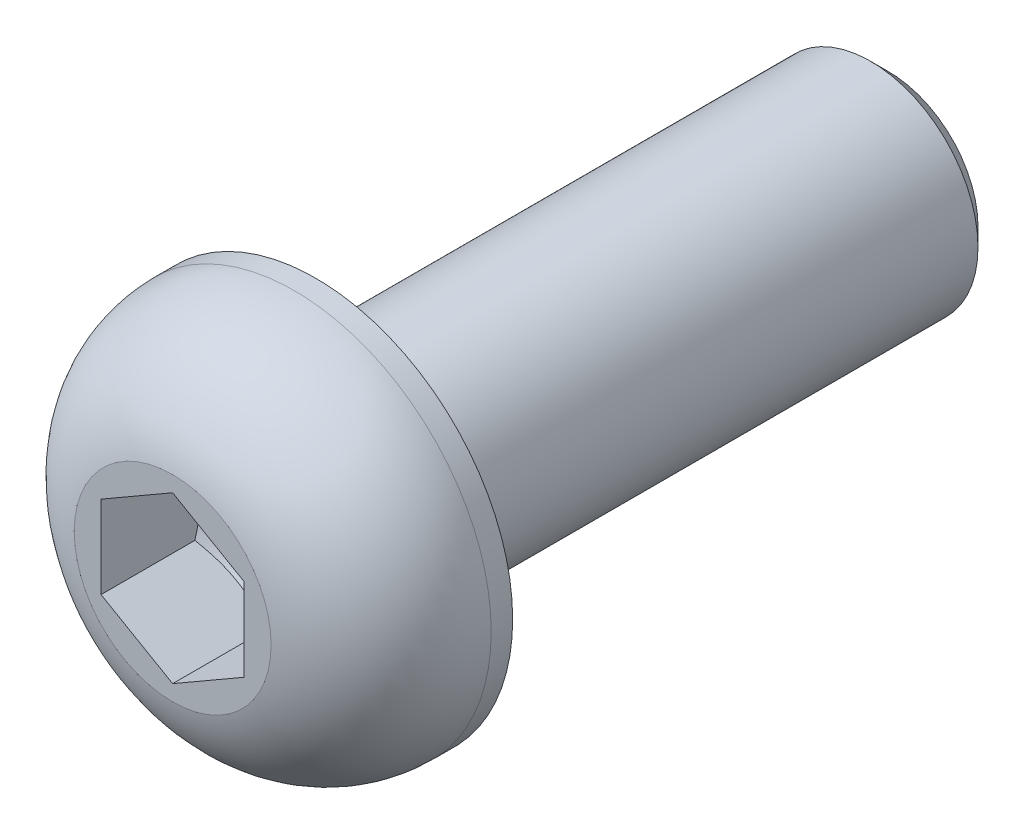
ISO-10303-21;
HEADER;
FILE_DESCRIPTION(('STEP AP214'),'2;1');
FILE_NAME('part.step','',(''),(''),'','','');
FILE_SCHEMA(('AUTOMOTIVE_DESIGN { 1 0 10303 214 1 1 1 1 }'));
ENDSEC;
DATA;
#1=APPLICATION_CONTEXT('core data for automotive mechanical design processes');
#2=APPLICATION_PROTOCOL_DEFINITION('international standard','automotive_design',2000,#1);
#3=PRODUCT_CONTEXT('',#1,'mechanical');
#4=PRODUCT('Part','Part','',(#3));
#5=PRODUCT_RELATED_PRODUCT_CATEGORY('part','',(#4));
#6=PRODUCT_DEFINITION_FORMATION('','',#4);
#7=PRODUCT_DEFINITION_CONTEXT('part definition',#1,'design');
#8=PRODUCT_DEFINITION('design','',#6,#7);
#9=PRODUCT_DEFINITION_SHAPE('','',#8);
#10=(LENGTH_UNIT() NAMED_UNIT(*) SI_UNIT(.MILLI.,.METRE.));
#11=(NAMED_UNIT(*) PLANE_ANGLE_UNIT() SI_UNIT($,.RADIAN.));
#12=(NAMED_UNIT(*) SI_UNIT($,.STERADIAN.) SOLID_ANGLE_UNIT());
#13=UNCERTAINTY_MEASURE_WITH_UNIT(LENGTH_MEASURE(1.E-05),#10,'distance_accuracy_value','');
#14=(GEOMETRIC_REPRESENTATION_CONTEXT(3) GLOBAL_UNCERTAINTY_ASSIGNED_CONTEXT((#13)) GLOBAL_UNIT_ASSIGNED_CONTEXT((#10,
#11,#12)) REPRESENTATION_CONTEXT('',''));
#15=CARTESIAN_POINT('',(0.,0.,0.));
#16=DIRECTION('',(0.,0.,1.));
#17=DIRECTION('',(1.,0.,0.));
#18=AXIS2_PLACEMENT_3D('',#15,#16,#17);
#19=CARTESIAN_POINT('',(0.,1.375,2.));
#20=DIRECTION('',(0.,0.,-1.));
#21=DIRECTION('',(-1.,0.,0.));
#22=AXIS2_PLACEMENT_3D('',#19,#20,#21);
#23=PLANE('',#22);
#24=CARTESIAN_POINT('',(0.,0.,2.));
#25=DIRECTION('',(0.,0.,1.));
#26=DIRECTION('',(1.,0.,0.));
#27=AXIS2_PLACEMENT_3D('',#24,#25,#26);
#28=CIRCLE('',#27,1.375);
#29=CARTESIAN_POINT('',(1.375,0.,2.));
#30=VERTEX_POINT('',#29);
#31=EDGE_CURVE('E160',#30,#30,#28,.T.);
#32=ORIENTED_EDGE('',*,*,#31,.T.);
#33=EDGE_LOOP('',(#32));
#34=FACE_BOUND('',#33,.T.);
#35=DIRECTION('',(-0.866025403784438,-0.5,0.));
#36=VECTOR('',#35,1.);
#37=CARTESIAN_POINT('',(0.,1.15470053837925,2.));
#38=LINE('',#37,#36);
#39=CARTESIAN_POINT('',(0.,1.15470053837925,2.));
#40=VERTEX_POINT('',#39);
#41=CARTESIAN_POINT('',(-1.,0.577350269189624,2.));
#42=VERTEX_POINT('',#41);
#43=EDGE_CURVE('E98',#40,#42,#38,.T.);
#44=ORIENTED_EDGE('',*,*,#43,.F.);
#45=DIRECTION('',(-0.866025403784439,0.5,0.));
#46=VECTOR('',#45,1.);
#47=CARTESIAN_POINT('',(1.,0.577350269189625,2.));
#48=LINE('',#47,#46);
#49=CARTESIAN_POINT('',(1.,0.577350269189625,2.));
#50=VERTEX_POINT('',#49);
#51=EDGE_CURVE('E58',#50,#40,#48,.T.);
#52=ORIENTED_EDGE('',*,*,#51,.F.);
#53=DIRECTION('',(0.,1.,0.));
#54=VECTOR('',#53,1.);
#55=CARTESIAN_POINT('',(1.,-0.577350269189626,2.));
#56=LINE('',#55,#54);
#57=CARTESIAN_POINT('',(1.,-0.577350269189626,2.));
#58=VERTEX_POINT('',#57);
#59=EDGE_CURVE('E133',#58,#50,#56,.T.);
#60=ORIENTED_EDGE('',*,*,#59,.F.);
#61=DIRECTION('',(0.866025403784439,0.5,0.));
#62=VECTOR('',#61,1.);
#63=CARTESIAN_POINT('',(0.,-1.15470053837925,2.));
#64=LINE('',#63,#62);
#65=CARTESIAN_POINT('',(0.,-1.15470053837925,2.));
#66=VERTEX_POINT('',#65);
#67=EDGE_CURVE('E126',#66,#58,#64,.T.);
#68=ORIENTED_EDGE('',*,*,#67,.F.);
#69=DIRECTION('',(0.866025403784439,-0.5,0.));
#70=VECTOR('',#69,1.);
#71=CARTESIAN_POINT('',(-1.,-0.577350269189625,2.));
#72=LINE('',#71,#70);
#73=CARTESIAN_POINT('',(-1.,-0.577350269189625,2.));
#74=VERTEX_POINT('',#73);
#75=EDGE_CURVE('E120',#74,#66,#72,.T.);
#76=ORIENTED_EDGE('',*,*,#75,.F.);
#77=DIRECTION('',(0.,-1.,0.));
#78=VECTOR('',#77,1.);
#79=CARTESIAN_POINT('',(-1.,0.577350269189624,2.));
#80=LINE('',#79,#78);
#81=EDGE_CURVE('E107',#42,#74,#80,.T.);
#82=ORIENTED_EDGE('',*,*,#81,.F.);
#83=EDGE_LOOP('',(#44,#52,#60,#68,#76,#82));
#84=FACE_BOUND('',#83,.T.);
#85=ADVANCED_FACE('F42',(#34,#84),#23,.F.);
#86=CARTESIAN_POINT('',(0.,0.,-8.));
#87=DIRECTION('',(0.,0.,1.));
#88=DIRECTION('',(1.,0.,0.));
#89=AXIS2_PLACEMENT_3D('',#86,#87,#88);
#90=PLANE('',#89);
#91=CARTESIAN_POINT('',(0.,0.,-8.));
#92=DIRECTION('',(0.,0.,1.));
#93=DIRECTION('',(1.,0.,0.));
#94=AXIS2_PLACEMENT_3D('',#91,#92,#93);
#95=CIRCLE('',#94,1.25);
#96=CARTESIAN_POINT('',(1.25,0.,-8.));
#97=VERTEX_POINT('',#96);
#98=EDGE_CURVE('E11',#97,#97,#95,.F.);
#99=ORIENTED_EDGE('',*,*,#98,.T.);
#100=EDGE_LOOP('',(#99));
#101=FACE_BOUND('',#100,.T.);
#102=ADVANCED_FACE('F230',(#101),#90,.F.);
#103=CARTESIAN_POINT('',(0.,0.,14.7719033232628));
#104=DIRECTION('',(0.,0.,1.));
#105=DIRECTION('',(1.,0.,0.));
#106=AXIS2_PLACEMENT_3D('',#103,#104,#105);
#107=CYLINDRICAL_SURFACE('',#106,1.5);
#108=CARTESIAN_POINT('',(0.,0.,-7.75));
#109=DIRECTION('',(0.,0.,1.));
#110=DIRECTION('',(1.,0.,0.));
#111=AXIS2_PLACEMENT_3D('',#108,#109,#110);
#112=CIRCLE('',#111,1.5);
#113=CARTESIAN_POINT('',(1.5,0.,-7.75));
#114=VERTEX_POINT('',#113);
#115=EDGE_CURVE('E51',#114,#114,#112,.T.);
#116=ORIENTED_EDGE('',*,*,#115,.T.);
#117=EDGE_LOOP('',(#116));
#118=FACE_BOUND('',#117,.T.);
#119=CARTESIAN_POINT('',(0.,0.,0.));
#120=DIRECTION('',(0.,0.,1.));
#121=DIRECTION('',(1.,0.,0.));
#122=AXIS2_PLACEMENT_3D('',#119,#120,#121);
#123=CIRCLE('',#122,1.5);
#124=CARTESIAN_POINT('',(1.5,0.,0.));
#125=VERTEX_POINT('',#124);
#126=EDGE_CURVE('E248',#125,#125,#123,.T.);
#127=ORIENTED_EDGE('',*,*,#126,.F.);
#128=EDGE_LOOP('',(#127));
#129=FACE_BOUND('',#128,.T.);
#130=ADVANCED_FACE('F235',(#118,#129),#107,.T.);
#131=CARTESIAN_POINT('',(0.,1.5,0.));
#132=DIRECTION('',(0.,0.,1.));
#133=DIRECTION('',(1.,0.,0.));
#134=AXIS2_PLACEMENT_3D('',#131,#132,#133);
#135=PLANE('',#134);
#136=CARTESIAN_POINT('',(0.,0.,0.));
#137=DIRECTION('',(0.,0.,1.));
#138=DIRECTION('',(1.,0.,0.));
#139=AXIS2_PLACEMENT_3D('',#136,#137,#138);
#140=CIRCLE('',#139,2.75);
#141=CARTESIAN_POINT('',(2.75,0.,0.));
#142=VERTEX_POINT('',#141);
#143=EDGE_CURVE('E243',#142,#142,#140,.T.);
#144=ORIENTED_EDGE('',*,*,#143,.F.);
#145=EDGE_LOOP('',(#144));
#146=FACE_BOUND('',#145,.T.);
#147=ORIENTED_EDGE('',*,*,#126,.T.);
#148=EDGE_LOOP('',(#147));
#149=FACE_BOUND('',#148,.T.);
#150=ADVANCED_FACE('F271',(#146,#149),#135,.F.);
#151=CARTESIAN_POINT('',(0.,0.,14.7719033232628));
#152=DIRECTION('',(0.,0.,1.));
#153=DIRECTION('',(1.,0.,0.));
#154=AXIS2_PLACEMENT_3D('',#151,#152,#153);
#155=CYLINDRICAL_SURFACE('',#154,2.75);
#156=CARTESIAN_POINT('',(0.,0.,0.3));
#157=DIRECTION('',(0.,0.,1.));
#158=DIRECTION('',(1.,0.,0.));
#159=AXIS2_PLACEMENT_3D('',#156,#157,#158);
#160=CIRCLE('',#159,2.75);
#161=CARTESIAN_POINT('',(2.75,0.,0.3));
#162=VERTEX_POINT('',#161);
#163=EDGE_CURVE('E241',#162,#162,#160,.T.);
#164=ORIENTED_EDGE('',*,*,#163,.F.);
#165=EDGE_LOOP('',(#164));
#166=FACE_BOUND('',#165,.T.);
#167=ORIENTED_EDGE('',*,*,#143,.T.);
#168=EDGE_LOOP('',(#167));
#169=FACE_BOUND('',#168,.T.);
#170=ADVANCED_FACE('F266',(#166,#169),#155,.T.);
#171=CARTESIAN_POINT('',(0.,0.,0.3));
#172=DIRECTION('',(0.,0.,1.));
#173=DIRECTION('',(1.,0.,0.));
#174=AXIS2_PLACEMENT_3D('',#171,#172,#173);
#175=DEGENERATE_TOROIDAL_SURFACE('',#174,1.01159090909091,1.73840909090909,.T.);
#176=ORIENTED_EDGE('',*,*,#31,.F.);
#177=EDGE_LOOP('',(#176));
#178=FACE_BOUND('',#177,.T.);
#179=ORIENTED_EDGE('',*,*,#163,.T.);
#180=EDGE_LOOP('',(#179));
#181=FACE_BOUND('',#180,.T.);
#182=ADVANCED_FACE('F260',(#178,#181),#175,.T.);
#183=CARTESIAN_POINT('',(0.,0.,-7.75));
#184=DIRECTION('',(0.,0.,1.));
#185=DIRECTION('',(1.,0.,0.));
#186=AXIS2_PLACEMENT_3D('',#183,#184,#185);
#187=CONICAL_SURFACE('',#186,1.5,0.78539816339745);
#188=ORIENTED_EDGE('',*,*,#98,.F.);
#189=EDGE_LOOP('',(#188));
#190=FACE_BOUND('',#189,.T.);
#191=ORIENTED_EDGE('',*,*,#115,.F.);
#192=EDGE_LOOP('',(#191));
#193=FACE_BOUND('',#192,.T.);
#194=ADVANCED_FACE('F44',(#190,#193),#187,.T.);
#195=CARTESIAN_POINT('',(1.,0.577350269189625,-8.001));
#196=DIRECTION('',(0.5,0.866025403784438,0.));
#197=DIRECTION('',(-0.866025403784439,0.5,0.));
#198=AXIS2_PLACEMENT_3D('',#195,#196,#197);
#199=PLANE('',#198);
#200=CARTESIAN_POINT('',(-0.000199999999999327,1.15481600843309,0.689383074142708));
#201=CARTESIAN_POINT('',(0.0437473193982807,1.12944301174833,0.674725371126188));
#202=CARTESIAN_POINT('',(0.088073983949821,1.10385100003722,0.661394121097936));
#203=CARTESIAN_POINT('',(0.177495074671123,1.05222370923805,0.638122905100496));
#204=CARTESIAN_POINT('',(0.222591091201732,1.02618751195472,0.628191174026823));
#205=CARTESIAN_POINT('',(0.31222417052262,0.974437829480509,0.61272909235912));
#206=CARTESIAN_POINT('',(0.35674743223322,0.948732312346694,0.607095865575994));
#207=CARTESIAN_POINT('',(0.446003739715018,0.897200159195205,0.600367686117294));
#208=CARTESIAN_POINT('',(0.490736460481496,0.871373710819095,0.599267165398705));
#209=CARTESIAN_POINT('',(0.574341110817348,0.823104543442187,0.601541449775179));
#210=CARTESIAN_POINT('',(0.613225476788767,0.800654644281319,0.60435783634045));
#211=CARTESIAN_POINT('',(0.690740844985187,0.755901125586783,0.613288847694391));
#212=CARTESIAN_POINT('',(0.72937157856164,0.733597661157426,0.61940653123134));
#213=CARTESIAN_POINT('',(0.807047116484146,0.688751668428418,0.634702123202864));
#214=CARTESIAN_POINT('',(0.846082076271168,0.666214823887575,0.643944949646001));
#215=CARTESIAN_POINT('',(0.923569381276012,0.621477507484249,0.664923243232571));
#216=CARTESIAN_POINT('',(0.962022721293859,0.599276461273705,0.676653772610704));
#217=CARTESIAN_POINT('',(1.0002,0.577234799135788,0.689383074142708));
#218=B_SPLINE_CURVE_WITH_KNOTS('',3,(#200,#201,#202,#203,#204,#205,#206,#207,#208,#209,#210,
#211,#212,#213,#214,#215,#216,#217),.UNSPECIFIED.,.F.,.F.,(4,2,2,2,2,2,2,2,4),(0.,
0.158523820030116,0.317428970089343,0.472400167924634,0.627180939971649,0.762016584872712,
0.896977373984233,1.03493410168667,1.17261952416172),.UNSPECIFIED.);
#219=CARTESIAN_POINT('',(0.,1.15470053837925,0.689316397477042));
#220=VERTEX_POINT('',#219);
#221=CARTESIAN_POINT('',(1.,0.577350269189625,0.689316397477042));
#222=VERTEX_POINT('',#221);
#223=EDGE_CURVE('E161',#220,#222,#218,.T.);
#224=ORIENTED_EDGE('',*,*,#223,.T.);
#225=DIRECTION('',(0.,0.,1.));
#226=VECTOR('',#225,1.);
#227=CARTESIAN_POINT('',(1.,0.577350269189625,-8.001));
#228=LINE('',#227,#226);
#229=EDGE_CURVE('E136',#222,#50,#228,.T.);
#230=ORIENTED_EDGE('',*,*,#229,.T.);
#231=ORIENTED_EDGE('',*,*,#51,.T.);
#232=DIRECTION('',(0.,0.,1.));
#233=VECTOR('',#232,1.);
#234=CARTESIAN_POINT('',(0.,1.15470053837925,-8.001));
#235=LINE('',#234,#233);
#236=EDGE_CURVE('E103',#220,#40,#235,.T.);
#237=ORIENTED_EDGE('',*,*,#236,.F.);
#238=EDGE_LOOP('',(#224,#230,#231,#237));
#239=FACE_BOUND('',#238,.T.);
#240=ADVANCED_FACE('F171',(#239),#199,.F.);
#241=CARTESIAN_POINT('',(1.,-0.577350269189626,-8.001));
#242=DIRECTION('',(1.,0.,0.));
#243=DIRECTION('',(0.,1.,0.));
#244=AXIS2_PLACEMENT_3D('',#241,#242,#243);
#245=PLANE('',#244);
#246=CARTESIAN_POINT('',(1.,-1.56461625528364,1.09472311547174));
#247=CARTESIAN_POINT('',(1.,-1.52079499734677,1.07340863056256));
#248=CARTESIAN_POINT('',(1.,-1.47687498421635,1.05229812070288));
#249=CARTESIAN_POINT('',(1.,-1.38878384730275,1.01059070590997));
#250=CARTESIAN_POINT('',(1.,-1.34461268635773,0.989993879549379));
#251=CARTESIAN_POINT('',(1.,-1.21119982144206,0.928930533668273));
#252=CARTESIAN_POINT('',(1.,-1.12151489984587,0.889415813924548));
#253=CARTESIAN_POINT('',(1.,-0.937576713530856,0.813175874508062));
#254=CARTESIAN_POINT('',(1.,-0.843269086998663,0.77658032651508));
#255=CARTESIAN_POINT('',(1.,-0.652272334384317,0.710551775503784));
#256=CARTESIAN_POINT('',(1.,-0.555589101753361,0.681102698372736));
#257=CARTESIAN_POINT('',(1.,-0.408661232850146,0.645827460264464));
#258=CARTESIAN_POINT('',(1.,-0.359495053837032,0.635566946083279));
#259=CARTESIAN_POINT('',(1.,-0.260536197502252,0.618649214018789));
#260=CARTESIAN_POINT('',(1.,-0.210743593690912,0.611991577303676));
#261=CARTESIAN_POINT('',(1.,-0.111434663726945,0.602894456290143));
#262=CARTESIAN_POINT('',(1.,-0.0619235309104463,0.600399817509566));
#263=CARTESIAN_POINT('',(1.,0.0371303773373432,0.599688903403631));
#264=CARTESIAN_POINT('',(1.,0.0866731541769787,0.601472834014161));
#265=CARTESIAN_POINT('',(1.,0.204624350946088,0.610659971318301));
#266=CARTESIAN_POINT('',(1.,0.272884420114126,0.619977024961571));
#267=CARTESIAN_POINT('',(1.,0.408206929769774,0.645142826472753));
#268=CARTESIAN_POINT('',(1.,0.475267983539709,0.660998683797671));
#269=CARTESIAN_POINT('',(1.,0.575668987392459,0.688608289939154));
#270=CARTESIAN_POINT('',(1.,0.609515152607504,0.698595243171582));
#271=CARTESIAN_POINT('',(1.,0.676856430852944,0.719627116389912));
#272=CARTESIAN_POINT('',(1.,0.710351738920768,0.730671409735579));
#273=CARTESIAN_POINT('',(1.,0.777033339887853,0.753645581755855));
#274=CARTESIAN_POINT('',(1.,0.810219645842317,0.765575422823641));
#275=CARTESIAN_POINT('',(1.,0.876319770511067,0.790178187160948));
#276=CARTESIAN_POINT('',(0.999999999999999,0.909233551297762,0.802851211940419));
#277=CARTESIAN_POINT('',(0.999999999999999,1.01934169805935,0.846436222995125));
#278=CARTESIAN_POINT('',(0.999999999999999,1.09598118747863,0.878749348370681));
#279=CARTESIAN_POINT('',(0.999999999999999,1.24826893926839,0.945642453097311));
#280=CARTESIAN_POINT('',(0.999999999999999,1.32391697167074,0.980222947576952));
#281=CARTESIAN_POINT('',(0.999999999999999,1.47451993616702,1.05096415163354));
#282=CARTESIAN_POINT('',(0.999999999999999,1.54947445242947,1.08712574315354));
#283=CARTESIAN_POINT('',(0.999999999999999,1.69883785981991,1.16056127735209));
#284=CARTESIAN_POINT('',(0.999999999999999,1.7732467274398,1.19783526760929));
#285=CARTESIAN_POINT('',(0.999999999999999,1.99621082001519,1.31103166071074));
#286=CARTESIAN_POINT('',(0.999999999999999,2.14415263874811,1.38815975370857));
#287=CARTESIAN_POINT('',(0.999999999999999,2.43901274776553,1.54420308959703));
#288=CARTESIAN_POINT('',(0.999999999999999,2.58593139478534,1.62311766414626));
#289=CARTESIAN_POINT('',(0.999999999999999,2.85769653623644,1.77046631950725));
#290=CARTESIAN_POINT('',(0.999999999999999,2.98262757635445,1.83874462800003));
#291=CARTESIAN_POINT('',(0.999999999999999,3.23217965834939,1.97589734768577));
#292=CARTESIAN_POINT('',(0.999999999999999,3.35680066410952,2.04477182449327));
#293=CARTESIAN_POINT('',(0.999999999999999,3.60527049804183,2.18264970140428));
#294=CARTESIAN_POINT('',(0.999999999999998,3.72912034192021,2.25165127264976));
#295=CARTESIAN_POINT('',(0.999999999999998,3.97662428827574,2.38996919233029));
#296=CARTESIAN_POINT('',(0.999999999999998,4.10027841286109,2.45928550119292));
#297=CARTESIAN_POINT('',(0.999999999999998,4.22386926622729,2.52871381473293));
#298=B_SPLINE_CURVE_WITH_KNOTS('',3,(#246,#247,#248,#249,#250,#251,#252,#253,#254,#255,#256,
#257,#258,#259,#260,#261,#262,#263,#264,#265,#266,#267,#268,#269,#270,#271,#272,#273,#274,#275,
#276,#277,#278,#279,#280,#281,#282,#283,#284,#285,#286,#287,#288,#289,#290,#291,#292,#293,#294,
#295,#296,#297),.UNSPECIFIED.,.F.,.F.,(4,2,2,2,2,2,2,2,2,2,2,2,2,2,2,2,2,2,2,2,2,2,2,2,2,4),(0.,
0.146187831920744,0.292397889155073,0.586343089145063,0.889691473641029,1.19235109649664,
1.34291989510469,1.4934711864406,1.64201154906353,1.79055906136725,1.99681766302277,
2.2033011175938,2.30915425790313,2.41494504743426,2.52073134688346,2.62653212927526,
2.87598574887021,3.12549624008317,3.3751477307062,3.62480991457381,4.12530205258155,
4.62560994834962,5.05272258223352,5.47988283767622,5.90520571256295,6.33047651520576),.UNSPECIFIED.);
#299=CARTESIAN_POINT('',(1.,-0.577350269189626,0.689316397477042));
#300=VERTEX_POINT('',#299);
#301=EDGE_CURVE('E200',#222,#300,#298,.F.);
#302=ORIENTED_EDGE('',*,*,#301,.T.);
#303=DIRECTION('',(0.,0.,1.));
#304=VECTOR('',#303,1.);
#305=CARTESIAN_POINT('',(1.,-0.577350269189626,-8.001));
#306=LINE('',#305,#304);
#307=EDGE_CURVE('E139',#300,#58,#306,.T.);
#308=ORIENTED_EDGE('',*,*,#307,.T.);
#309=ORIENTED_EDGE('',*,*,#59,.T.);
#310=ORIENTED_EDGE('',*,*,#229,.F.);
#311=EDGE_LOOP('',(#302,#308,#309,#310));
#312=FACE_BOUND('',#311,.T.);
#313=ADVANCED_FACE('F212',(#312),#245,.F.);
#314=CARTESIAN_POINT('',(0.,-1.15470053837925,-8.001));
#315=DIRECTION('',(0.5,-0.866025403784439,0.));
#316=DIRECTION('',(0.866025403784439,0.5,0.));
#317=AXIS2_PLACEMENT_3D('',#314,#315,#316);
#318=PLANE('',#317);
#319=CARTESIAN_POINT('',(1.0002,-0.577234799135788,0.689383074142709));
#320=CARTESIAN_POINT('',(0.95625268060172,-0.602607795820547,0.674725371126189));
#321=CARTESIAN_POINT('',(0.911926016050179,-0.628199807531657,0.661394121097937));
#322=CARTESIAN_POINT('',(0.822504925328878,-0.679827098330831,0.638122905100496));
#323=CARTESIAN_POINT('',(0.777408908798268,-0.705863295614158,0.628191174026823));
#324=CARTESIAN_POINT('',(0.687775829477381,-0.757612978088368,0.61272909235912));
#325=CARTESIAN_POINT('',(0.64325256776678,-0.783318495222183,0.607095865575994));
#326=CARTESIAN_POINT('',(0.553996260284982,-0.834850648373671,0.600367686117295));
#327=CARTESIAN_POINT('',(0.509263539518504,-0.860677096749781,0.599267165398705));
#328=CARTESIAN_POINT('',(0.425658889182652,-0.90894626412669,0.601541449775179));
#329=CARTESIAN_POINT('',(0.386774523211233,-0.931396163287557,0.60435783634045));
#330=CARTESIAN_POINT('',(0.309259155014813,-0.976149681982093,0.613288847694391));
#331=CARTESIAN_POINT('',(0.27062842143836,-0.998453146411451,0.619406531231341));
#332=CARTESIAN_POINT('',(0.192952883515855,-1.04329913914046,0.634702123202864));
#333=CARTESIAN_POINT('',(0.153917923728833,-1.0658359836813,0.643944949646001));
#334=CARTESIAN_POINT('',(0.0764306187239887,-1.11057330008463,0.664923243232571));
#335=CARTESIAN_POINT('',(0.0379772787061418,-1.13277434629517,0.676653772610704));
#336=CARTESIAN_POINT('',(-0.000199999999998659,-1.15481600843309,0.689383074142708));
#337=B_SPLINE_CURVE_WITH_KNOTS('',3,(#319,#320,#321,#322,#323,#324,#325,#326,#327,#328,#329,
#330,#331,#332,#333,#334,#335,#336),.UNSPECIFIED.,.F.,.F.,(4,2,2,2,2,2,2,2,4),(0.,
0.158523820030116,0.317428970089343,0.472400167924635,0.627180939971649,0.762016584872712,
0.896977373984233,1.03493410168667,1.17261952416172),.UNSPECIFIED.);
#338=CARTESIAN_POINT('',(0.,-1.15470053837925,0.689316397477042));
#339=VERTEX_POINT('',#338);
#340=EDGE_CURVE('E193',#300,#339,#337,.T.);
#341=ORIENTED_EDGE('',*,*,#340,.T.);
#342=DIRECTION('',(0.,0.,1.));
#343=VECTOR('',#342,1.);
#344=CARTESIAN_POINT('',(0.,-1.15470053837925,-8.001));
#345=LINE('',#344,#343);
#346=EDGE_CURVE('E143',#339,#66,#345,.T.);
#347=ORIENTED_EDGE('',*,*,#346,.T.);
#348=ORIENTED_EDGE('',*,*,#67,.T.);
#349=ORIENTED_EDGE('',*,*,#307,.F.);
#350=EDGE_LOOP('',(#341,#347,#348,#349));
#351=FACE_BOUND('',#350,.T.);
#352=ADVANCED_FACE('F215',(#351),#318,.F.);
#353=CARTESIAN_POINT('',(-1.,-0.577350269189625,-8.001));
#354=DIRECTION('',(-0.5,-0.866025403784439,0.));
#355=DIRECTION('',(0.866025403784439,-0.5,0.));
#356=AXIS2_PLACEMENT_3D('',#353,#354,#355);
#357=PLANE('',#356);
#358=CARTESIAN_POINT('',(0.000200000000001301,-1.15481600843309,0.689383074142708));
#359=CARTESIAN_POINT('',(-0.0437473193982788,-1.12944301174833,0.674725371126188));
#360=CARTESIAN_POINT('',(-0.0880739839498192,-1.10385100003722,0.661394121097936));
#361=CARTESIAN_POINT('',(-0.177495074671121,-1.05222370923805,0.638122905100496));
#362=CARTESIAN_POINT('',(-0.22259109120173,-1.02618751195472,0.628191174026823));
#363=CARTESIAN_POINT('',(-0.312224170522618,-0.974437829480509,0.61272909235912));
#364=CARTESIAN_POINT('',(-0.356747432233219,-0.948732312346694,0.607095865575994));
#365=CARTESIAN_POINT('',(-0.446003739715017,-0.897200159195206,0.600367686117294));
#366=CARTESIAN_POINT('',(-0.490736460481494,-0.871373710819095,0.599267165398704));
#367=CARTESIAN_POINT('',(-0.574341110817346,-0.823104543442187,0.601541449775178));
#368=CARTESIAN_POINT('',(-0.613225476788766,-0.80065464428132,0.60435783634045));
#369=CARTESIAN_POINT('',(-0.690740844985186,-0.755901125586784,0.613288847694391));
#370=CARTESIAN_POINT('',(-0.729371578561639,-0.733597661157426,0.61940653123134));
#371=CARTESIAN_POINT('',(-0.807047116484145,-0.688751668428418,0.634702123202864));
#372=CARTESIAN_POINT('',(-0.846082076271168,-0.666214823887574,0.643944949646001));
#373=CARTESIAN_POINT('',(-0.923569381276012,-0.621477507484249,0.664923243232572));
#374=CARTESIAN_POINT('',(-0.962022721293859,-0.599276461273704,0.676653772610705));
#375=CARTESIAN_POINT('',(-1.0002,-0.577234799135787,0.689383074142708));
#376=B_SPLINE_CURVE_WITH_KNOTS('',3,(#358,#359,#360,#361,#362,#363,#364,#365,#366,#367,#368,
#369,#370,#371,#372,#373,#374,#375),.UNSPECIFIED.,.F.,.F.,(4,2,2,2,2,2,2,2,4),(0.,
0.158523820030116,0.317428970089343,0.472400167924634,0.627180939971649,0.762016584872712,
0.896977373984234,1.03493410168667,1.17261952416172),.UNSPECIFIED.);
#377=CARTESIAN_POINT('',(-1.,-0.577350269189704,0.689316397476989));
#378=VERTEX_POINT('',#377);
#379=EDGE_CURVE('E186',#339,#378,#376,.T.);
#380=ORIENTED_EDGE('',*,*,#379,.T.);
#381=DIRECTION('',(0.,0.,1.));
#382=VECTOR('',#381,1.);
#383=CARTESIAN_POINT('',(-1.,-0.577350269189625,-8.001));
#384=LINE('',#383,#382);
#385=EDGE_CURVE('E116',#378,#74,#384,.T.);
#386=ORIENTED_EDGE('',*,*,#385,.T.);
#387=ORIENTED_EDGE('',*,*,#75,.T.);
#388=ORIENTED_EDGE('',*,*,#346,.F.);
#389=EDGE_LOOP('',(#380,#386,#387,#388));
#390=FACE_BOUND('',#389,.T.);
#391=ADVANCED_FACE('F219',(#390),#357,.F.);
#392=CARTESIAN_POINT('',(-1.,0.577350269189624,-8.001));
#393=DIRECTION('',(-1.,0.,0.));
#394=DIRECTION('',(0.,0.,1.));
#395=AXIS2_PLACEMENT_3D('',#392,#393,#394);
#396=PLANE('',#395);
#397=CARTESIAN_POINT('',(-1.,-1.5646162549691,1.09472311531873));
#398=CARTESIAN_POINT('',(-1.,-1.52079499704286,1.07340863041596));
#399=CARTESIAN_POINT('',(-1.,-1.47687498392307,1.05229812056268));
#400=CARTESIAN_POINT('',(-1.,-1.38878384703077,1.01059070578255));
#401=CARTESIAN_POINT('',(-1.,-1.34461268609642,0.989993879428334));
#402=CARTESIAN_POINT('',(-1.,-1.21119982121305,0.928930533566388));
#403=CARTESIAN_POINT('',(-1.,-1.12151489963857,0.889415813835362));
#404=CARTESIAN_POINT('',(-1.,-0.937576713368663,0.813175874444224));
#405=CARTESIAN_POINT('',(-1.,-0.843269086859891,0.776580326463843));
#406=CARTESIAN_POINT('',(-1.,-0.652272334293365,0.710551775475594));
#407=CARTESIAN_POINT('',(-1.,-0.555589101686804,0.681102698355001));
#408=CARTESIAN_POINT('',(-1.,-0.408661232827391,0.645827460259868));
#409=CARTESIAN_POINT('',(-1.,-0.359495053833185,0.635566946083004));
#410=CARTESIAN_POINT('',(-1.,-0.26053619753668,0.618649214024293));
#411=CARTESIAN_POINT('',(-1.,-0.210743593744705,0.611991577310641));
#412=CARTESIAN_POINT('',(-1.,-0.111434663819162,0.602894456296584));
#413=CARTESIAN_POINT('',(-1.,-0.0619235310217197,0.600399817514083));
#414=CARTESIAN_POINT('',(-1.,0.0371303771882504,0.599688903400977));
#415=CARTESIAN_POINT('',(-1.,0.0866731540091227,0.601472834006258));
#416=CARTESIAN_POINT('',(-1.,0.204624350749565,0.610659971295838));
#417=CARTESIAN_POINT('',(-1.,0.272884419907872,0.619977024930326));
#418=CARTESIAN_POINT('',(-1.,0.408206929544783,0.645142826423735));
#419=CARTESIAN_POINT('',(-1.,0.475267983305714,0.66099868373966));
#420=CARTESIAN_POINT('',(-1.,0.575668987144926,0.688608289867844));
#421=CARTESIAN_POINT('',(-1.,0.609515152355321,0.69859524309579));
#422=CARTESIAN_POINT('',(-1.,0.676856430591518,0.719627116305294));
#423=CARTESIAN_POINT('',(-1.,0.710351738654749,0.730671409646617));
#424=CARTESIAN_POINT('',(-1.,0.77703333961268,0.753645581658356));
#425=CARTESIAN_POINT('',(-1.,0.810219645562583,0.76557542272195));
#426=CARTESIAN_POINT('',(-1.,0.876319770222209,0.790178187051013));
#427=CARTESIAN_POINT('',(-1.,0.909233551004341,0.802851211826434));
#428=CARTESIAN_POINT('',(-1.,1.01934169773806,0.846436222862804));
#429=CARTESIAN_POINT('',(-1.,1.09598118713422,0.878749348223828));
#430=CARTESIAN_POINT('',(-1.,1.24826893887789,0.945642452921373));
#431=CARTESIAN_POINT('',(-1.,1.32391697125725,0.980222947386461));
#432=CARTESIAN_POINT('',(-1.,1.47451993570764,1.05096415141403));
#433=CARTESIAN_POINT('',(-1.,1.54947445194715,1.08712574291956));
#434=CARTESIAN_POINT('',(-1.,1.69883785929173,1.16056127708928));
#435=CARTESIAN_POINT('',(-1.,1.77324672688869,1.19783526733212));
#436=CARTESIAN_POINT('',(-1.,1.9962108193953,1.31103166039068));
#437=CARTESIAN_POINT('',(-1.,2.14415263808234,1.38815975336015));
#438=CARTESIAN_POINT('',(-1.,2.43901274700784,1.54420308919221));
#439=CARTESIAN_POINT('',(-1.,2.58593139398162,1.62311766371341));
#440=CARTESIAN_POINT('',(-1.,2.85769653535064,1.77046631902449));
#441=CARTESIAN_POINT('',(-1.,2.98262757543261,1.83874462749538));
#442=CARTESIAN_POINT('',(-1.,3.23217965735539,1.97589734713749));
#443=CARTESIAN_POINT('',(-1.,3.3568006630794,2.04477182392326));
#444=CARTESIAN_POINT('',(-1.,3.60527049693923,2.18264970079083));
#445=CARTESIAN_POINT('',(-1.,3.72912034078125,2.2516512720146));
#446=CARTESIAN_POINT('',(-1.,3.97662428706401,2.3899691916518));
#447=CARTESIAN_POINT('',(-1.,4.10027841161295,2.45928550049281));
#448=CARTESIAN_POINT('',(-1.,4.22386926494273,2.52871381401124));
#449=B_SPLINE_CURVE_WITH_KNOTS('',3,(#397,#398,#399,#400,#401,#402,#403,#404,#405,#406,#407,
#408,#409,#410,#411,#412,#413,#414,#415,#416,#417,#418,#419,#420,#421,#422,#423,#424,#425,#426,
#427,#428,#429,#430,#431,#432,#433,#434,#435,#436,#437,#438,#439,#440,#441,#442,#443,#444,#445,
#446,#447,#448),.UNSPECIFIED.,.F.,.F.,(4,2,2,2,2,2,2,2,2,2,2,2,2,2,2,2,2,2,2,2,2,2,2,2,2,4),(0.,
0.146187831883667,0.292397889080913,0.586343088995952,0.889691473412743,1.19235109618949,
1.34291989473949,1.49347118601743,1.64201154858377,1.79055906083088,1.99681766245395,
2.20330111699243,2.30915425728457,2.41494504679852,2.52073134623058,2.62653212860524,
2.87598574811934,3.12549623925145,3.37514772979366,3.62480991358046,4.12530205142678,
4.6256099470334,5.05272258079092,5.47988283610724,5.90520571086699,6.3304765133828),.UNSPECIFIED.);
#450=CARTESIAN_POINT('',(-1.,0.577350269189624,0.689316397477041));
#451=VERTEX_POINT('',#450);
#452=EDGE_CURVE('E114',#378,#451,#449,.T.);
#453=ORIENTED_EDGE('',*,*,#452,.T.);
#454=DIRECTION('',(0.,0.,1.));
#455=VECTOR('',#454,1.);
#456=CARTESIAN_POINT('',(-1.,0.577350269189624,-8.001));
#457=LINE('',#456,#455);
#458=EDGE_CURVE('E102',#451,#42,#457,.T.);
#459=ORIENTED_EDGE('',*,*,#458,.T.);
#460=ORIENTED_EDGE('',*,*,#81,.T.);
#461=ORIENTED_EDGE('',*,*,#385,.F.);
#462=EDGE_LOOP('',(#453,#459,#460,#461));
#463=FACE_BOUND('',#462,.T.);
#464=ADVANCED_FACE('F111',(#463),#396,.F.);
#465=CARTESIAN_POINT('',(0.,1.15470053837925,-8.001));
#466=DIRECTION('',(-0.5,0.866025403784438,0.));
#467=DIRECTION('',(-0.866025403784438,-0.5,0.));
#468=AXIS2_PLACEMENT_3D('',#465,#466,#467);
#469=PLANE('',#468);
#470=CARTESIAN_POINT('',(-1.0002,0.577234799135786,0.689383074142708));
#471=CARTESIAN_POINT('',(-0.95625268060172,0.602607795820546,0.674725371126188));
#472=CARTESIAN_POINT('',(-0.91192601605018,0.628199807531656,0.661394121097936));
#473=CARTESIAN_POINT('',(-0.822504925328878,0.679827098330829,0.638122905100496));
#474=CARTESIAN_POINT('',(-0.777408908798268,0.705863295614157,0.628191174026823));
#475=CARTESIAN_POINT('',(-0.687775829477381,0.757612978088366,0.612729092359119));
#476=CARTESIAN_POINT('',(-0.64325256776678,0.783318495222181,0.607095865575993));
#477=CARTESIAN_POINT('',(-0.553996260284982,0.83485064837367,0.600367686117294));
#478=CARTESIAN_POINT('',(-0.509263539518505,0.86067709674978,0.599267165398704));
#479=CARTESIAN_POINT('',(-0.425658889182653,0.908946264126688,0.601541449775178));
#480=CARTESIAN_POINT('',(-0.386774523211233,0.931396163287556,0.604357836340449));
#481=CARTESIAN_POINT('',(-0.309259155014813,0.976149681982092,0.613288847694391));
#482=CARTESIAN_POINT('',(-0.27062842143836,0.99845314641145,0.61940653123134));
#483=CARTESIAN_POINT('',(-0.192952883515854,1.04329913914046,0.634702123202864));
#484=CARTESIAN_POINT('',(-0.153917923728832,1.0658359836813,0.643944949646001));
#485=CARTESIAN_POINT('',(-0.0764306187239871,1.11057330008463,0.664923243232571));
#486=CARTESIAN_POINT('',(-0.03797727870614,1.13277434629517,0.676653772610704));
#487=CARTESIAN_POINT('',(0.000200000000000572,1.15481600843309,0.689383074142708));
#488=B_SPLINE_CURVE_WITH_KNOTS('',3,(#470,#471,#472,#473,#474,#475,#476,#477,#478,#479,#480,
#481,#482,#483,#484,#485,#486,#487),.UNSPECIFIED.,.F.,.F.,(4,2,2,2,2,2,2,2,4),(0.,
0.158523820030116,0.317428970089343,0.472400167924634,0.627180939971649,0.762016584872712,
0.896977373984234,1.03493410168667,1.17261952416172),.UNSPECIFIED.);
#489=EDGE_CURVE('E151',#451,#220,#488,.T.);
#490=ORIENTED_EDGE('',*,*,#489,.T.);
#491=ORIENTED_EDGE('',*,*,#236,.T.);
#492=ORIENTED_EDGE('',*,*,#43,.T.);
#493=ORIENTED_EDGE('',*,*,#458,.F.);
#494=EDGE_LOOP('',(#490,#491,#492,#493));
#495=FACE_BOUND('',#494,.T.);
#496=ADVANCED_FACE('F101',(#495),#469,.F.);
#497=CARTESIAN_POINT('',(0.,0.,0.0226497308103678));
#498=DIRECTION('',(0.,0.,1.));
#499=DIRECTION('',(1.,0.,0.));
#500=AXIS2_PLACEMENT_3D('',#497,#498,#499);
#501=CONICAL_SURFACE('',#500,0.,1.04719755119659);
#502=ORIENTED_EDGE('',*,*,#340,.F.);
#503=ORIENTED_EDGE('',*,*,#301,.F.);
#504=ORIENTED_EDGE('',*,*,#223,.F.);
#505=ORIENTED_EDGE('',*,*,#489,.F.);
#506=ORIENTED_EDGE('',*,*,#452,.F.);
#507=ORIENTED_EDGE('',*,*,#379,.F.);
#508=EDGE_LOOP('',(#502,#503,#504,#505,#506,#507));
#509=FACE_BOUND('',#508,.T.);
#510=CARTESIAN_POINT('',(0.,0.,0.0226497308103678));
#511=VERTEX_POINT('',#510);
#512=VERTEX_LOOP('',#511);
#513=FACE_BOUND('',#512,.T.);
#514=ADVANCED_FACE('F166',(#509,#513),#501,.F.);
#515=CLOSED_SHELL('',(#85,#102,#130,#150,#170,#182,#194,#240,#313,#352,#391,#464,#496,#514));
#516=MANIFOLD_SOLID_BREP('B2',#515);
#517=ADVANCED_BREP_SHAPE_REPRESENTATION('',(#18,#516),#14);
#518=SHAPE_DEFINITION_REPRESENTATION(#9,#517);
ENDSEC;
END-ISO-10303-21;
